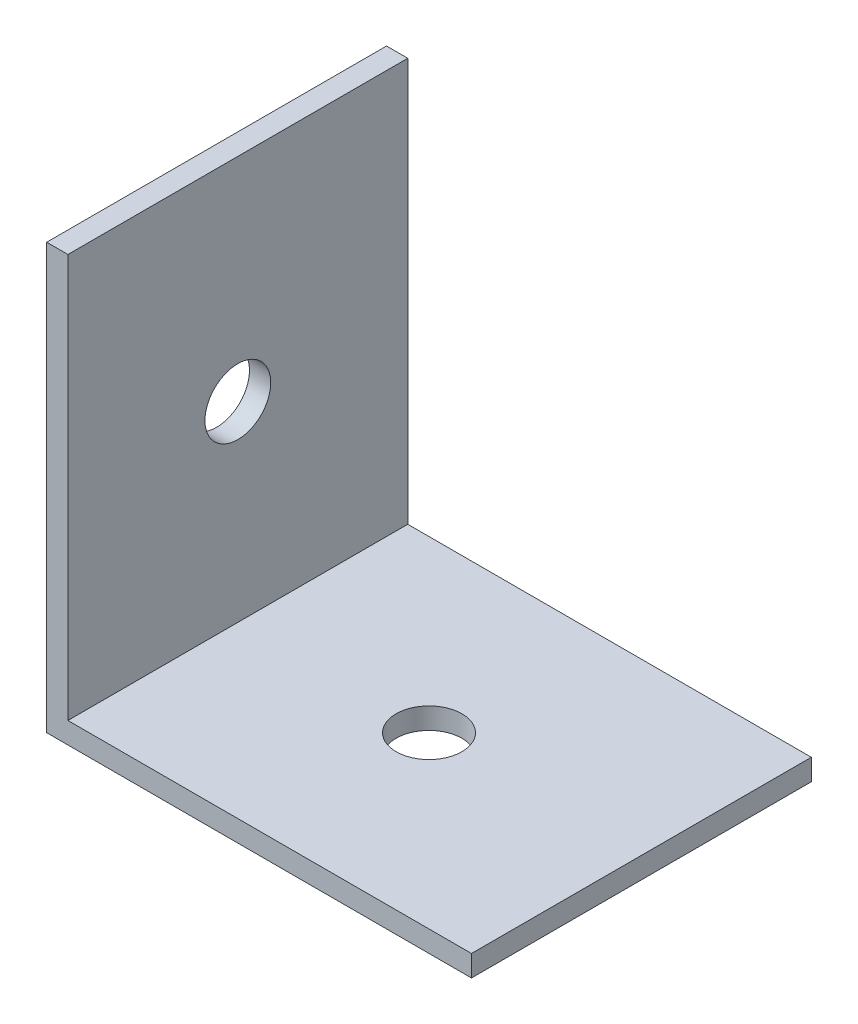
ISO-10303-21;
HEADER;
FILE_DESCRIPTION(('STEP AP214'),'2;1');
FILE_NAME('part.step','',(''),(''),'','','');
FILE_SCHEMA(('AUTOMOTIVE_DESIGN { 1 0 10303 214 1 1 1 1 }'));
ENDSEC;
DATA;
#1=APPLICATION_CONTEXT('core data for automotive mechanical design processes');
#2=APPLICATION_PROTOCOL_DEFINITION('international standard','automotive_design',2000,#1);
#3=PRODUCT_CONTEXT('',#1,'mechanical');
#4=PRODUCT('Part','Part','',(#3));
#5=PRODUCT_RELATED_PRODUCT_CATEGORY('part','',(#4));
#6=PRODUCT_DEFINITION_FORMATION('','',#4);
#7=PRODUCT_DEFINITION_CONTEXT('part definition',#1,'design');
#8=PRODUCT_DEFINITION('design','',#6,#7);
#9=PRODUCT_DEFINITION_SHAPE('','',#8);
#10=(LENGTH_UNIT() NAMED_UNIT(*) SI_UNIT(.MILLI.,.METRE.));
#11=(NAMED_UNIT(*) PLANE_ANGLE_UNIT() SI_UNIT($,.RADIAN.));
#12=(NAMED_UNIT(*) SI_UNIT($,.STERADIAN.) SOLID_ANGLE_UNIT());
#13=UNCERTAINTY_MEASURE_WITH_UNIT(LENGTH_MEASURE(1.E-05),#10,'distance_accuracy_value','');
#14=(GEOMETRIC_REPRESENTATION_CONTEXT(3) GLOBAL_UNCERTAINTY_ASSIGNED_CONTEXT((#13)) GLOBAL_UNIT_ASSIGNED_CONTEXT((#10,
#11,#12)) REPRESENTATION_CONTEXT('',''));
#15=CARTESIAN_POINT('',(0.,0.,0.));
#16=DIRECTION('',(0.,0.,1.));
#17=DIRECTION('',(1.,0.,0.));
#18=AXIS2_PLACEMENT_3D('',#15,#16,#17);
#19=CARTESIAN_POINT('',(0.,0.,25.4));
#20=DIRECTION('',(0.,1.,0.));
#21=DIRECTION('',(0.,0.,1.));
#22=AXIS2_PLACEMENT_3D('',#19,#20,#21);
#23=PLANE('',#22);
#24=CARTESIAN_POINT('',(15.875,0.,12.7));
#25=DIRECTION('',(0.,-1.,0.));
#26=DIRECTION('',(0.,0.,-1.));
#27=AXIS2_PLACEMENT_3D('',#24,#25,#26);
#28=CIRCLE('',#27,2.45744999999999);
#29=CARTESIAN_POINT('',(15.875,0.,10.24255));
#30=VERTEX_POINT('',#29);
#31=EDGE_CURVE('E160',#30,#30,#28,.T.);
#32=ORIENTED_EDGE('',*,*,#31,.F.);
#33=EDGE_LOOP('',(#32));
#34=FACE_BOUND('',#33,.T.);
#35=DIRECTION('',(1.,0.,0.));
#36=VECTOR('',#35,1.);
#37=CARTESIAN_POINT('',(0.,0.,0.));
#38=LINE('',#37,#36);
#39=CARTESIAN_POINT('',(0.,0.,0.));
#40=VERTEX_POINT('',#39);
#41=CARTESIAN_POINT('',(31.75,0.,0.));
#42=VERTEX_POINT('',#41);
#43=EDGE_CURVE('E116',#40,#42,#38,.T.);
#44=ORIENTED_EDGE('',*,*,#43,.T.);
#45=DIRECTION('',(0.,0.,-1.));
#46=VECTOR('',#45,1.);
#47=CARTESIAN_POINT('',(31.75,0.,25.4));
#48=LINE('',#47,#46);
#49=CARTESIAN_POINT('',(31.75,0.,25.4));
#50=VERTEX_POINT('',#49);
#51=EDGE_CURVE('E11',#50,#42,#48,.T.);
#52=ORIENTED_EDGE('',*,*,#51,.F.);
#53=DIRECTION('',(1.,0.,0.));
#54=VECTOR('',#53,1.);
#55=CARTESIAN_POINT('',(0.,0.,25.4));
#56=LINE('',#55,#54);
#57=CARTESIAN_POINT('',(0.,0.,25.4));
#58=VERTEX_POINT('',#57);
#59=EDGE_CURVE('E127',#58,#50,#56,.T.);
#60=ORIENTED_EDGE('',*,*,#59,.F.);
#61=DIRECTION('',(0.,0.,-1.));
#62=VECTOR('',#61,1.);
#63=CARTESIAN_POINT('',(0.,0.,25.4));
#64=LINE('',#63,#62);
#65=EDGE_CURVE('E112',#58,#40,#64,.T.);
#66=ORIENTED_EDGE('',*,*,#65,.T.);
#67=EDGE_LOOP('',(#44,#52,#60,#66));
#68=FACE_BOUND('',#67,.T.);
#69=ADVANCED_FACE('F32',(#34,#68),#23,.F.);
#70=CARTESIAN_POINT('',(31.75,1.5875,25.4));
#71=DIRECTION('',(-1.,0.,0.));
#72=DIRECTION('',(0.,0.,1.));
#73=AXIS2_PLACEMENT_3D('',#70,#71,#72);
#74=PLANE('',#73);
#75=DIRECTION('',(0.,1.,0.));
#76=VECTOR('',#75,1.);
#77=CARTESIAN_POINT('',(31.75,1.5875,0.));
#78=LINE('',#77,#76);
#79=CARTESIAN_POINT('',(31.75,1.5875,0.));
#80=VERTEX_POINT('',#79);
#81=EDGE_CURVE('E119',#42,#80,#78,.T.);
#82=ORIENTED_EDGE('',*,*,#81,.T.);
#83=DIRECTION('',(0.,0.,-1.));
#84=VECTOR('',#83,1.);
#85=CARTESIAN_POINT('',(31.75,1.5875,25.4));
#86=LINE('',#85,#84);
#87=CARTESIAN_POINT('',(31.75,1.5875,25.4));
#88=VERTEX_POINT('',#87);
#89=EDGE_CURVE('E40',#88,#80,#86,.T.);
#90=ORIENTED_EDGE('',*,*,#89,.F.);
#91=DIRECTION('',(0.,1.,0.));
#92=VECTOR('',#91,1.);
#93=CARTESIAN_POINT('',(31.75,1.5875,25.4));
#94=LINE('',#93,#92);
#95=EDGE_CURVE('E85',#50,#88,#94,.T.);
#96=ORIENTED_EDGE('',*,*,#95,.F.);
#97=ORIENTED_EDGE('',*,*,#51,.T.);
#98=EDGE_LOOP('',(#82,#90,#96,#97));
#99=FACE_BOUND('',#98,.T.);
#100=ADVANCED_FACE('F153',(#99),#74,.F.);
#101=CARTESIAN_POINT('',(1.5875,1.5875,25.4));
#102=DIRECTION('',(0.,-1.,0.));
#103=DIRECTION('',(0.,0.,-1.));
#104=AXIS2_PLACEMENT_3D('',#101,#102,#103);
#105=PLANE('',#104);
#106=CARTESIAN_POINT('',(15.875,1.5875,12.7));
#107=DIRECTION('',(0.,-1.,0.));
#108=DIRECTION('',(0.,0.,-1.));
#109=AXIS2_PLACEMENT_3D('',#106,#107,#108);
#110=CIRCLE('',#109,2.45744999999999);
#111=CARTESIAN_POINT('',(15.875,1.5875,10.24255));
#112=VERTEX_POINT('',#111);
#113=EDGE_CURVE('E120',#112,#112,#110,.T.);
#114=ORIENTED_EDGE('',*,*,#113,.T.);
#115=EDGE_LOOP('',(#114));
#116=FACE_BOUND('',#115,.T.);
#117=DIRECTION('',(-1.,0.,0.));
#118=VECTOR('',#117,1.);
#119=CARTESIAN_POINT('',(1.5875,1.5875,0.));
#120=LINE('',#119,#118);
#121=CARTESIAN_POINT('',(1.5875,1.5875,0.));
#122=VERTEX_POINT('',#121);
#123=EDGE_CURVE('E122',#80,#122,#120,.T.);
#124=ORIENTED_EDGE('',*,*,#123,.T.);
#125=DIRECTION('',(0.,0.,-1.));
#126=VECTOR('',#125,1.);
#127=CARTESIAN_POINT('',(1.5875,1.5875,25.4));
#128=LINE('',#127,#126);
#129=CARTESIAN_POINT('',(1.5875,1.5875,25.4));
#130=VERTEX_POINT('',#129);
#131=EDGE_CURVE('E107',#130,#122,#128,.T.);
#132=ORIENTED_EDGE('',*,*,#131,.F.);
#133=DIRECTION('',(-1.,0.,0.));
#134=VECTOR('',#133,1.);
#135=CARTESIAN_POINT('',(1.5875,1.5875,25.4));
#136=LINE('',#135,#134);
#137=EDGE_CURVE('E98',#88,#130,#136,.T.);
#138=ORIENTED_EDGE('',*,*,#137,.F.);
#139=ORIENTED_EDGE('',*,*,#89,.T.);
#140=EDGE_LOOP('',(#124,#132,#138,#139));
#141=FACE_BOUND('',#140,.T.);
#142=ADVANCED_FACE('F133',(#116,#141),#105,.F.);
#143=CARTESIAN_POINT('',(1.5875,31.75,25.4));
#144=DIRECTION('',(-1.,0.,0.));
#145=DIRECTION('',(0.,-1.,0.));
#146=AXIS2_PLACEMENT_3D('',#143,#144,#145);
#147=PLANE('',#146);
#148=CARTESIAN_POINT('',(1.5875,15.875,12.7));
#149=DIRECTION('',(-1.,0.,0.));
#150=DIRECTION('',(0.,-1.,0.));
#151=AXIS2_PLACEMENT_3D('',#148,#149,#150);
#152=CIRCLE('',#151,2.45744999999999);
#153=CARTESIAN_POINT('',(1.5875,13.41755,12.7));
#154=VERTEX_POINT('',#153);
#155=EDGE_CURVE('E162',#154,#154,#152,.T.);
#156=ORIENTED_EDGE('',*,*,#155,.T.);
#157=EDGE_LOOP('',(#156));
#158=FACE_BOUND('',#157,.T.);
#159=DIRECTION('',(0.,1.,0.));
#160=VECTOR('',#159,1.);
#161=CARTESIAN_POINT('',(1.5875,31.75,0.));
#162=LINE('',#161,#160);
#163=CARTESIAN_POINT('',(1.5875,31.75,0.));
#164=VERTEX_POINT('',#163);
#165=EDGE_CURVE('E106',#122,#164,#162,.T.);
#166=ORIENTED_EDGE('',*,*,#165,.T.);
#167=DIRECTION('',(0.,0.,-1.));
#168=VECTOR('',#167,1.);
#169=CARTESIAN_POINT('',(1.5875,31.75,25.4));
#170=LINE('',#169,#168);
#171=CARTESIAN_POINT('',(1.5875,31.75,25.4));
#172=VERTEX_POINT('',#171);
#173=EDGE_CURVE('E103',#172,#164,#170,.T.);
#174=ORIENTED_EDGE('',*,*,#173,.F.);
#175=DIRECTION('',(0.,1.,0.));
#176=VECTOR('',#175,1.);
#177=CARTESIAN_POINT('',(1.5875,31.75,25.4));
#178=LINE('',#177,#176);
#179=EDGE_CURVE('E92',#130,#172,#178,.T.);
#180=ORIENTED_EDGE('',*,*,#179,.F.);
#181=ORIENTED_EDGE('',*,*,#131,.T.);
#182=EDGE_LOOP('',(#166,#174,#180,#181));
#183=FACE_BOUND('',#182,.T.);
#184=ADVANCED_FACE('F104',(#158,#183),#147,.F.);
#185=CARTESIAN_POINT('',(0.,31.75,25.4));
#186=DIRECTION('',(0.,-1.,0.));
#187=DIRECTION('',(0.,0.,-1.));
#188=AXIS2_PLACEMENT_3D('',#185,#186,#187);
#189=PLANE('',#188);
#190=DIRECTION('',(-1.,0.,0.));
#191=VECTOR('',#190,1.);
#192=CARTESIAN_POINT('',(0.,31.75,0.));
#193=LINE('',#192,#191);
#194=CARTESIAN_POINT('',(0.,31.75,0.));
#195=VERTEX_POINT('',#194);
#196=EDGE_CURVE('E71',#164,#195,#193,.T.);
#197=ORIENTED_EDGE('',*,*,#196,.T.);
#198=DIRECTION('',(0.,0.,-1.));
#199=VECTOR('',#198,1.);
#200=CARTESIAN_POINT('',(0.,31.75,25.4));
#201=LINE('',#200,#199);
#202=CARTESIAN_POINT('',(0.,31.75,25.4));
#203=VERTEX_POINT('',#202);
#204=EDGE_CURVE('E108',#203,#195,#201,.T.);
#205=ORIENTED_EDGE('',*,*,#204,.F.);
#206=DIRECTION('',(-1.,0.,0.));
#207=VECTOR('',#206,1.);
#208=CARTESIAN_POINT('',(0.,31.75,25.4));
#209=LINE('',#208,#207);
#210=EDGE_CURVE('E96',#172,#203,#209,.T.);
#211=ORIENTED_EDGE('',*,*,#210,.F.);
#212=ORIENTED_EDGE('',*,*,#173,.T.);
#213=EDGE_LOOP('',(#197,#205,#211,#212));
#214=FACE_BOUND('',#213,.T.);
#215=ADVANCED_FACE('F110',(#214),#189,.F.);
#216=CARTESIAN_POINT('',(0.,0.,25.4));
#217=DIRECTION('',(1.,0.,0.));
#218=DIRECTION('',(0.,0.,-1.));
#219=AXIS2_PLACEMENT_3D('',#216,#217,#218);
#220=PLANE('',#219);
#221=CARTESIAN_POINT('',(0.,15.875,12.7));
#222=DIRECTION('',(-1.,0.,0.));
#223=DIRECTION('',(0.,0.,1.));
#224=AXIS2_PLACEMENT_3D('',#221,#222,#223);
#225=CIRCLE('',#224,2.45744999999999);
#226=CARTESIAN_POINT('',(0.,15.875,15.15745));
#227=VERTEX_POINT('',#226);
#228=EDGE_CURVE('E167',#227,#227,#225,.T.);
#229=ORIENTED_EDGE('',*,*,#228,.F.);
#230=EDGE_LOOP('',(#229));
#231=FACE_BOUND('',#230,.T.);
#232=DIRECTION('',(0.,-1.,0.));
#233=VECTOR('',#232,1.);
#234=CARTESIAN_POINT('',(0.,0.,0.));
#235=LINE('',#234,#233);
#236=EDGE_CURVE('E77',#195,#40,#235,.T.);
#237=ORIENTED_EDGE('',*,*,#236,.T.);
#238=ORIENTED_EDGE('',*,*,#65,.F.);
#239=DIRECTION('',(0.,-1.,0.));
#240=VECTOR('',#239,1.);
#241=CARTESIAN_POINT('',(0.,0.,25.4));
#242=LINE('',#241,#240);
#243=EDGE_CURVE('E48',#203,#58,#242,.T.);
#244=ORIENTED_EDGE('',*,*,#243,.F.);
#245=ORIENTED_EDGE('',*,*,#204,.T.);
#246=EDGE_LOOP('',(#237,#238,#244,#245));
#247=FACE_BOUND('',#246,.T.);
#248=ADVANCED_FACE('F140',(#231,#247),#220,.F.);
#249=CARTESIAN_POINT('',(0.,0.,25.4));
#250=DIRECTION('',(0.,0.,-1.));
#251=DIRECTION('',(-1.,0.,0.));
#252=AXIS2_PLACEMENT_3D('',#249,#250,#251);
#253=PLANE('',#252);
#254=ORIENTED_EDGE('',*,*,#59,.T.);
#255=ORIENTED_EDGE('',*,*,#95,.T.);
#256=ORIENTED_EDGE('',*,*,#137,.T.);
#257=ORIENTED_EDGE('',*,*,#179,.T.);
#258=ORIENTED_EDGE('',*,*,#210,.T.);
#259=ORIENTED_EDGE('',*,*,#243,.T.);
#260=EDGE_LOOP('',(#254,#255,#256,#257,#258,#259));
#261=FACE_BOUND('',#260,.T.);
#262=ADVANCED_FACE('F94',(#261),#253,.F.);
#263=CARTESIAN_POINT('',(0.,0.,0.));
#264=DIRECTION('',(0.,0.,-1.));
#265=DIRECTION('',(-1.,0.,0.));
#266=AXIS2_PLACEMENT_3D('',#263,#264,#265);
#267=PLANE('',#266);
#268=ORIENTED_EDGE('',*,*,#43,.F.);
#269=ORIENTED_EDGE('',*,*,#236,.F.);
#270=ORIENTED_EDGE('',*,*,#196,.F.);
#271=ORIENTED_EDGE('',*,*,#165,.F.);
#272=ORIENTED_EDGE('',*,*,#123,.F.);
#273=ORIENTED_EDGE('',*,*,#81,.F.);
#274=EDGE_LOOP('',(#268,#269,#270,#271,#272,#273));
#275=FACE_BOUND('',#274,.T.);
#276=ADVANCED_FACE('F136',(#275),#267,.T.);
#277=CARTESIAN_POINT('',(15.875,0.,12.7));
#278=DIRECTION('',(0.,-1.,0.));
#279=DIRECTION('',(0.,0.,-1.));
#280=AXIS2_PLACEMENT_3D('',#277,#278,#279);
#281=CYLINDRICAL_SURFACE('',#280,2.45744999999999);
#282=ORIENTED_EDGE('',*,*,#31,.T.);
#283=EDGE_LOOP('',(#282));
#284=FACE_BOUND('',#283,.T.);
#285=ORIENTED_EDGE('',*,*,#113,.F.);
#286=EDGE_LOOP('',(#285));
#287=FACE_BOUND('',#286,.T.);
#288=ADVANCED_FACE('F177',(#284,#287),#281,.F.);
#289=CARTESIAN_POINT('',(0.,15.875,12.7));
#290=DIRECTION('',(-1.,0.,0.));
#291=DIRECTION('',(0.,0.,1.));
#292=AXIS2_PLACEMENT_3D('',#289,#290,#291);
#293=CYLINDRICAL_SURFACE('',#292,2.45744999999999);
#294=ORIENTED_EDGE('',*,*,#228,.T.);
#295=EDGE_LOOP('',(#294));
#296=FACE_BOUND('',#295,.T.);
#297=ORIENTED_EDGE('',*,*,#155,.F.);
#298=EDGE_LOOP('',(#297));
#299=FACE_BOUND('',#298,.T.);
#300=ADVANCED_FACE('F174',(#296,#299),#293,.F.);
#301=CLOSED_SHELL('',(#69,#100,#142,#184,#215,#248,#262,#276,#288,#300));
#302=MANIFOLD_SOLID_BREP('B2',#301);
#303=ADVANCED_BREP_SHAPE_REPRESENTATION('',(#18,#302),#14);
#304=SHAPE_DEFINITION_REPRESENTATION(#9,#303);
ENDSEC;
END-ISO-10303-21;
